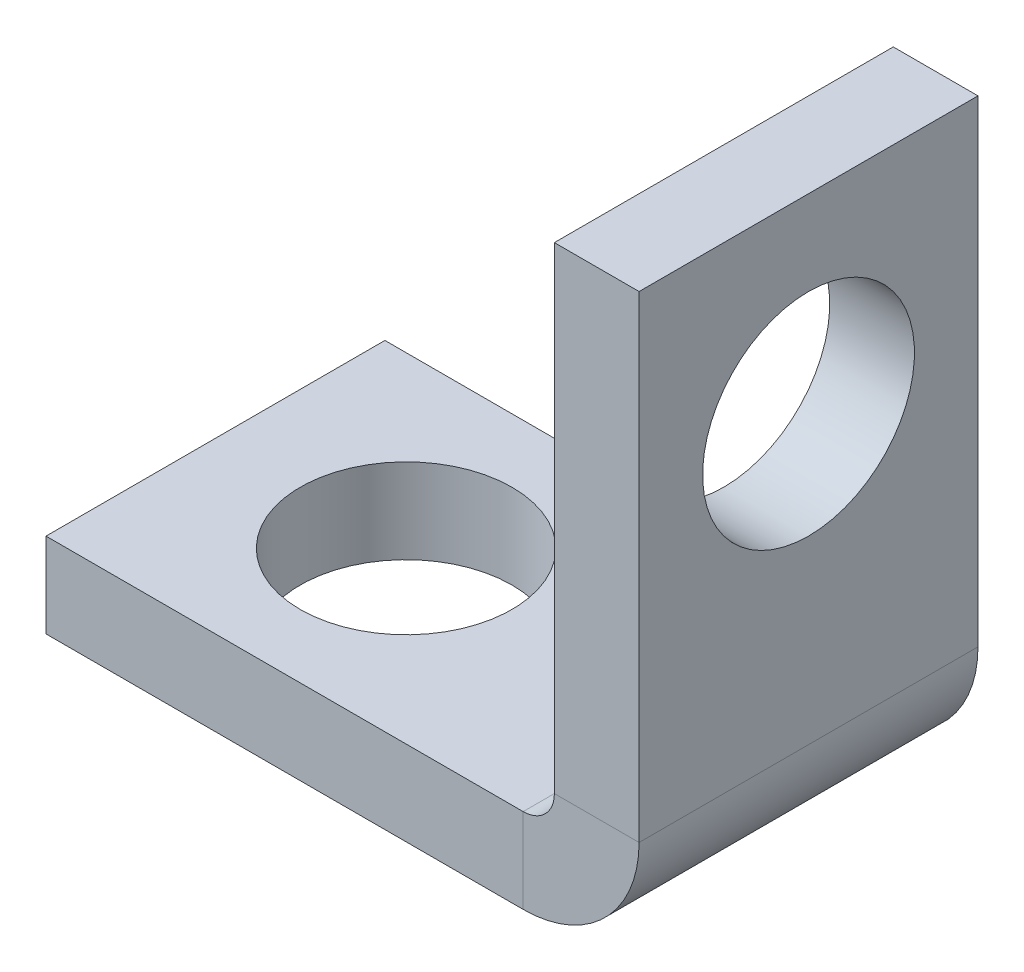
ISO-10303-21;
HEADER;
FILE_DESCRIPTION(('STEP AP214'),'2;1');
FILE_NAME('part.step','',(''),(''),'','','');
FILE_SCHEMA(('AUTOMOTIVE_DESIGN { 1 0 10303 214 1 1 1 1 }'));
ENDSEC;
DATA;
#1=APPLICATION_CONTEXT('core data for automotive mechanical design processes');
#2=APPLICATION_PROTOCOL_DEFINITION('international standard','automotive_design',2000,#1);
#3=PRODUCT_CONTEXT('',#1,'mechanical');
#4=PRODUCT('Part','Part','',(#3));
#5=PRODUCT_RELATED_PRODUCT_CATEGORY('part','',(#4));
#6=PRODUCT_DEFINITION_FORMATION('','',#4);
#7=PRODUCT_DEFINITION_CONTEXT('part definition',#1,'design');
#8=PRODUCT_DEFINITION('design','',#6,#7);
#9=PRODUCT_DEFINITION_SHAPE('','',#8);
#10=(LENGTH_UNIT() NAMED_UNIT(*) SI_UNIT(.MILLI.,.METRE.));
#11=(NAMED_UNIT(*) PLANE_ANGLE_UNIT() SI_UNIT($,.RADIAN.));
#12=(NAMED_UNIT(*) SI_UNIT($,.STERADIAN.) SOLID_ANGLE_UNIT());
#13=UNCERTAINTY_MEASURE_WITH_UNIT(LENGTH_MEASURE(1.E-05),#10,'distance_accuracy_value','');
#14=(GEOMETRIC_REPRESENTATION_CONTEXT(3) GLOBAL_UNCERTAINTY_ASSIGNED_CONTEXT((#13)) GLOBAL_UNIT_ASSIGNED_CONTEXT((#10,
#11,#12)) REPRESENTATION_CONTEXT('',''));
#15=CARTESIAN_POINT('',(0.,0.,0.));
#16=DIRECTION('',(0.,0.,1.));
#17=DIRECTION('',(1.,0.,0.));
#18=AXIS2_PLACEMENT_3D('',#15,#16,#17);
#19=CARTESIAN_POINT('',(7.,-2.,-4.));
#20=DIRECTION('',(0.,0.,-1.));
#21=DIRECTION('',(-1.,0.,0.));
#22=AXIS2_PLACEMENT_3D('',#19,#20,#21);
#23=PLANE('',#22);
#24=DIRECTION('',(-1.,0.,0.));
#25=VECTOR('',#24,1.);
#26=CARTESIAN_POINT('',(7.,0.,-4.));
#27=LINE('',#26,#25);
#28=CARTESIAN_POINT('',(4.2634,0.,-4.));
#29=VERTEX_POINT('',#28);
#30=CARTESIAN_POINT('',(-7.,0.,-4.));
#31=VERTEX_POINT('',#30);
#32=EDGE_CURVE('E94',#29,#31,#27,.T.);
#33=ORIENTED_EDGE('',*,*,#32,.F.);
#34=DIRECTION('',(0.,-1.,0.));
#35=VECTOR('',#34,1.);
#36=CARTESIAN_POINT('',(4.2634,0.,-4.));
#37=LINE('',#36,#35);
#38=CARTESIAN_POINT('',(4.2634,-2.,-4.));
#39=VERTEX_POINT('',#38);
#40=EDGE_CURVE('E121',#29,#39,#37,.T.);
#41=ORIENTED_EDGE('',*,*,#40,.T.);
#42=DIRECTION('',(-1.,0.,0.));
#43=VECTOR('',#42,1.);
#44=CARTESIAN_POINT('',(7.,-2.,-4.));
#45=LINE('',#44,#43);
#46=CARTESIAN_POINT('',(-7.,-2.,-4.));
#47=VERTEX_POINT('',#46);
#48=EDGE_CURVE('E83',#39,#47,#45,.T.);
#49=ORIENTED_EDGE('',*,*,#48,.T.);
#50=DIRECTION('',(0.,1.,0.));
#51=VECTOR('',#50,1.);
#52=CARTESIAN_POINT('',(-7.,-2.,-4.));
#53=LINE('',#52,#51);
#54=EDGE_CURVE('E13',#47,#31,#53,.T.);
#55=ORIENTED_EDGE('',*,*,#54,.T.);
#56=EDGE_LOOP('',(#33,#41,#49,#55));
#57=FACE_BOUND('',#56,.T.);
#58=ADVANCED_FACE('F60',(#57),#23,.T.);
#59=CARTESIAN_POINT('',(0.,-2.,0.));
#60=DIRECTION('',(0.,1.,0.));
#61=DIRECTION('',(0.,0.,1.));
#62=AXIS2_PLACEMENT_3D('',#59,#60,#61);
#63=PLANE('',#62);
#64=CARTESIAN_POINT('',(-2.5,-2.,0.));
#65=DIRECTION('',(0.,1.,0.));
#66=DIRECTION('',(0.,0.,1.));
#67=AXIS2_PLACEMENT_3D('',#64,#65,#66);
#68=CIRCLE('',#67,2.5);
#69=CARTESIAN_POINT('',(-2.5,-2.,2.5));
#70=VERTEX_POINT('',#69);
#71=EDGE_CURVE('E106',#70,#70,#68,.T.);
#72=ORIENTED_EDGE('',*,*,#71,.T.);
#73=EDGE_LOOP('',(#72));
#74=FACE_BOUND('',#73,.T.);
#75=DIRECTION('',(0.,0.,-1.));
#76=VECTOR('',#75,1.);
#77=CARTESIAN_POINT('',(4.2634,-2.,-4.));
#78=LINE('',#77,#76);
#79=CARTESIAN_POINT('',(4.2634,-2.,4.));
#80=VERTEX_POINT('',#79);
#81=EDGE_CURVE('E137',#39,#80,#78,.F.);
#82=ORIENTED_EDGE('',*,*,#81,.T.);
#83=DIRECTION('',(1.,0.,0.));
#84=VECTOR('',#83,1.);
#85=CARTESIAN_POINT('',(7.,-2.,4.));
#86=LINE('',#85,#84);
#87=CARTESIAN_POINT('',(-7.,-2.,4.));
#88=VERTEX_POINT('',#87);
#89=EDGE_CURVE('E114',#88,#80,#86,.T.);
#90=ORIENTED_EDGE('',*,*,#89,.F.);
#91=DIRECTION('',(0.,0.,1.));
#92=VECTOR('',#91,1.);
#93=CARTESIAN_POINT('',(-7.,-2.,4.));
#94=LINE('',#93,#92);
#95=EDGE_CURVE('E99',#47,#88,#94,.T.);
#96=ORIENTED_EDGE('',*,*,#95,.F.);
#97=ORIENTED_EDGE('',*,*,#48,.F.);
#98=EDGE_LOOP('',(#82,#90,#96,#97));
#99=FACE_BOUND('',#98,.T.);
#100=ADVANCED_FACE('F223',(#74,#99),#63,.F.);
#101=CARTESIAN_POINT('',(0.,0.,0.));
#102=DIRECTION('',(0.,1.,0.));
#103=DIRECTION('',(0.,0.,1.));
#104=AXIS2_PLACEMENT_3D('',#101,#102,#103);
#105=PLANE('',#104);
#106=CARTESIAN_POINT('',(-2.5,0.,0.));
#107=DIRECTION('',(0.,1.,0.));
#108=DIRECTION('',(0.,0.,1.));
#109=AXIS2_PLACEMENT_3D('',#106,#107,#108);
#110=CIRCLE('',#109,2.5);
#111=CARTESIAN_POINT('',(-2.5,0.,2.5));
#112=VERTEX_POINT('',#111);
#113=EDGE_CURVE('E110',#112,#112,#110,.T.);
#114=ORIENTED_EDGE('',*,*,#113,.F.);
#115=EDGE_LOOP('',(#114));
#116=FACE_BOUND('',#115,.T.);
#117=DIRECTION('',(1.,0.,0.));
#118=VECTOR('',#117,1.);
#119=CARTESIAN_POINT('',(7.,0.,4.));
#120=LINE('',#119,#118);
#121=CARTESIAN_POINT('',(-7.,0.,4.));
#122=VERTEX_POINT('',#121);
#123=CARTESIAN_POINT('',(4.2634,0.,4.));
#124=VERTEX_POINT('',#123);
#125=EDGE_CURVE('E100',#122,#124,#120,.T.);
#126=ORIENTED_EDGE('',*,*,#125,.T.);
#127=DIRECTION('',(0.,0.,-1.));
#128=VECTOR('',#127,1.);
#129=CARTESIAN_POINT('',(4.2634,0.,-4.));
#130=LINE('',#129,#128);
#131=EDGE_CURVE('E75',#29,#124,#130,.F.);
#132=ORIENTED_EDGE('',*,*,#131,.F.);
#133=ORIENTED_EDGE('',*,*,#32,.T.);
#134=DIRECTION('',(0.,0.,1.));
#135=VECTOR('',#134,1.);
#136=CARTESIAN_POINT('',(-7.,0.,4.));
#137=LINE('',#136,#135);
#138=EDGE_CURVE('E97',#31,#122,#137,.T.);
#139=ORIENTED_EDGE('',*,*,#138,.T.);
#140=EDGE_LOOP('',(#126,#132,#133,#139));
#141=FACE_BOUND('',#140,.T.);
#142=ADVANCED_FACE('F95',(#116,#141),#105,.T.);
#143=CARTESIAN_POINT('',(-7.,-2.,4.));
#144=DIRECTION('',(-1.,0.,0.));
#145=DIRECTION('',(0.,0.,1.));
#146=AXIS2_PLACEMENT_3D('',#143,#144,#145);
#147=PLANE('',#146);
#148=ORIENTED_EDGE('',*,*,#138,.F.);
#149=ORIENTED_EDGE('',*,*,#54,.F.);
#150=ORIENTED_EDGE('',*,*,#95,.T.);
#151=DIRECTION('',(0.,1.,0.));
#152=VECTOR('',#151,1.);
#153=CARTESIAN_POINT('',(-7.,-2.,4.));
#154=LINE('',#153,#152);
#155=EDGE_CURVE('E64',#88,#122,#154,.T.);
#156=ORIENTED_EDGE('',*,*,#155,.T.);
#157=EDGE_LOOP('',(#148,#149,#150,#156));
#158=FACE_BOUND('',#157,.T.);
#159=ADVANCED_FACE('F62',(#158),#147,.T.);
#160=CARTESIAN_POINT('',(7.,-2.,4.));
#161=DIRECTION('',(0.,0.,1.));
#162=DIRECTION('',(1.,0.,0.));
#163=AXIS2_PLACEMENT_3D('',#160,#161,#162);
#164=PLANE('',#163);
#165=DIRECTION('',(0.,-1.,0.));
#166=VECTOR('',#165,1.);
#167=CARTESIAN_POINT('',(4.2634,0.,4.));
#168=LINE('',#167,#166);
#169=EDGE_CURVE('E119',#124,#80,#168,.T.);
#170=ORIENTED_EDGE('',*,*,#169,.F.);
#171=ORIENTED_EDGE('',*,*,#125,.F.);
#172=ORIENTED_EDGE('',*,*,#155,.F.);
#173=ORIENTED_EDGE('',*,*,#89,.T.);
#174=EDGE_LOOP('',(#170,#171,#172,#173));
#175=FACE_BOUND('',#174,.T.);
#176=ADVANCED_FACE('F228',(#175),#164,.T.);
#177=CARTESIAN_POINT('',(-2.5,-2.,0.));
#178=DIRECTION('',(0.,1.,0.));
#179=DIRECTION('',(0.,0.,1.));
#180=AXIS2_PLACEMENT_3D('',#177,#178,#179);
#181=CYLINDRICAL_SURFACE('',#180,2.5);
#182=ORIENTED_EDGE('',*,*,#71,.F.);
#183=EDGE_LOOP('',(#182));
#184=FACE_BOUND('',#183,.T.);
#185=ORIENTED_EDGE('',*,*,#113,.T.);
#186=EDGE_LOOP('',(#185));
#187=FACE_BOUND('',#186,.T.);
#188=ADVANCED_FACE('F262',(#184,#187),#181,.F.);
#189=CARTESIAN_POINT('',(4.2634,0.7366,4.));
#190=DIRECTION('',(0.,0.,1.));
#191=DIRECTION('',(1.,0.,0.));
#192=AXIS2_PLACEMENT_3D('',#189,#190,#191);
#193=PLANE('',#192);
#194=DIRECTION('',(-1.,0.,0.));
#195=VECTOR('',#194,1.);
#196=CARTESIAN_POINT('',(7.,0.73659999999999,4.));
#197=LINE('',#196,#195);
#198=CARTESIAN_POINT('',(5.,0.736599999999997,4.));
#199=VERTEX_POINT('',#198);
#200=CARTESIAN_POINT('',(7.,0.73659999999999,4.));
#201=VERTEX_POINT('',#200);
#202=EDGE_CURVE('E142',#199,#201,#197,.F.);
#203=ORIENTED_EDGE('',*,*,#202,.F.);
#204=CARTESIAN_POINT('',(4.2634,0.7366,4.));
#205=DIRECTION('',(0.,0.,-1.));
#206=DIRECTION('',(-1.,0.,0.));
#207=AXIS2_PLACEMENT_3D('',#204,#205,#206);
#208=CIRCLE('',#207,0.7366);
#209=EDGE_CURVE('E131',#124,#199,#208,.F.);
#210=ORIENTED_EDGE('',*,*,#209,.F.);
#211=ORIENTED_EDGE('',*,*,#169,.T.);
#212=CARTESIAN_POINT('',(4.2634,0.7366,4.));
#213=DIRECTION('',(0.,0.,-1.));
#214=DIRECTION('',(-1.,0.,0.));
#215=AXIS2_PLACEMENT_3D('',#212,#213,#214);
#216=CIRCLE('',#215,2.7366);
#217=EDGE_CURVE('E123',#80,#201,#216,.F.);
#218=ORIENTED_EDGE('',*,*,#217,.T.);
#219=EDGE_LOOP('',(#203,#210,#211,#218));
#220=FACE_BOUND('',#219,.T.);
#221=ADVANCED_FACE('F229',(#220),#193,.T.);
#222=CARTESIAN_POINT('',(4.2634,0.7366,-4.));
#223=DIRECTION('',(0.,0.,1.));
#224=DIRECTION('',(1.,0.,0.));
#225=AXIS2_PLACEMENT_3D('',#222,#223,#224);
#226=PLANE('',#225);
#227=CARTESIAN_POINT('',(4.2634,0.7366,-4.));
#228=DIRECTION('',(0.,0.,-1.));
#229=DIRECTION('',(-1.,0.,0.));
#230=AXIS2_PLACEMENT_3D('',#227,#228,#229);
#231=CIRCLE('',#230,0.7366);
#232=CARTESIAN_POINT('',(5.,0.736599999999997,-4.));
#233=VERTEX_POINT('',#232);
#234=EDGE_CURVE('E126',#233,#29,#231,.T.);
#235=ORIENTED_EDGE('',*,*,#234,.F.);
#236=DIRECTION('',(-1.,0.,0.));
#237=VECTOR('',#236,1.);
#238=CARTESIAN_POINT('',(5.,0.736599999999997,-4.));
#239=LINE('',#238,#237);
#240=CARTESIAN_POINT('',(7.,0.73659999999999,-4.));
#241=VERTEX_POINT('',#240);
#242=EDGE_CURVE('E148',#233,#241,#239,.F.);
#243=ORIENTED_EDGE('',*,*,#242,.T.);
#244=CARTESIAN_POINT('',(4.2634,0.7366,-4.));
#245=DIRECTION('',(0.,0.,-1.));
#246=DIRECTION('',(-1.,0.,0.));
#247=AXIS2_PLACEMENT_3D('',#244,#245,#246);
#248=CIRCLE('',#247,2.7366);
#249=EDGE_CURVE('E134',#241,#39,#248,.T.);
#250=ORIENTED_EDGE('',*,*,#249,.T.);
#251=ORIENTED_EDGE('',*,*,#40,.F.);
#252=EDGE_LOOP('',(#235,#243,#250,#251));
#253=FACE_BOUND('',#252,.T.);
#254=ADVANCED_FACE('F240',(#253),#226,.F.);
#255=CARTESIAN_POINT('',(4.2634,0.7366,-4.));
#256=DIRECTION('',(0.,0.,-1.));
#257=DIRECTION('',(1.,0.,0.));
#258=AXIS2_PLACEMENT_3D('',#255,#256,#257);
#259=CYLINDRICAL_SURFACE('',#258,2.7366);
#260=ORIENTED_EDGE('',*,*,#81,.F.);
#261=ORIENTED_EDGE('',*,*,#249,.F.);
#262=DIRECTION('',(0.,0.,-1.));
#263=VECTOR('',#262,1.);
#264=CARTESIAN_POINT('',(7.,0.73659999999999,4.));
#265=LINE('',#264,#263);
#266=EDGE_CURVE('E151',#241,#201,#265,.F.);
#267=ORIENTED_EDGE('',*,*,#266,.T.);
#268=ORIENTED_EDGE('',*,*,#217,.F.);
#269=EDGE_LOOP('',(#260,#261,#267,#268));
#270=FACE_BOUND('',#269,.T.);
#271=ADVANCED_FACE('F230',(#270),#259,.T.);
#272=CARTESIAN_POINT('',(4.2634,0.7366,-4.));
#273=DIRECTION('',(0.,0.,-1.));
#274=DIRECTION('',(1.,0.,0.));
#275=AXIS2_PLACEMENT_3D('',#272,#273,#274);
#276=CYLINDRICAL_SURFACE('',#275,0.7366);
#277=ORIENTED_EDGE('',*,*,#131,.T.);
#278=ORIENTED_EDGE('',*,*,#209,.T.);
#279=DIRECTION('',(0.,0.,-1.));
#280=VECTOR('',#279,1.);
#281=CARTESIAN_POINT('',(5.,0.736599999999997,4.));
#282=LINE('',#281,#280);
#283=EDGE_CURVE('E145',#199,#233,#282,.T.);
#284=ORIENTED_EDGE('',*,*,#283,.T.);
#285=ORIENTED_EDGE('',*,*,#234,.T.);
#286=EDGE_LOOP('',(#277,#278,#284,#285));
#287=FACE_BOUND('',#286,.T.);
#288=ADVANCED_FACE('F242',(#287),#276,.F.);
#289=CARTESIAN_POINT('',(7.,0.,0.));
#290=DIRECTION('',(-1.,0.,0.));
#291=DIRECTION('',(0.,-1.,0.));
#292=AXIS2_PLACEMENT_3D('',#289,#290,#291);
#293=PLANE('',#292);
#294=CARTESIAN_POINT('',(7.00000000000003,7.5,0.));
#295=DIRECTION('',(-1.,0.,0.));
#296=DIRECTION('',(0.,-1.,0.));
#297=AXIS2_PLACEMENT_3D('',#294,#295,#296);
#298=CIRCLE('',#297,2.5);
#299=CARTESIAN_POINT('',(7.00000000000002,5.,0.));
#300=VERTEX_POINT('',#299);
#301=EDGE_CURVE('E157',#300,#300,#298,.F.);
#302=ORIENTED_EDGE('',*,*,#301,.F.);
#303=EDGE_LOOP('',(#302));
#304=FACE_BOUND('',#303,.T.);
#305=ORIENTED_EDGE('',*,*,#266,.F.);
#306=DIRECTION('',(0.,1.,0.));
#307=VECTOR('',#306,1.);
#308=CARTESIAN_POINT('',(7.,0.,-4.));
#309=LINE('',#308,#307);
#310=CARTESIAN_POINT('',(7.00000000000004,12.,-4.));
#311=VERTEX_POINT('',#310);
#312=EDGE_CURVE('E172',#241,#311,#309,.T.);
#313=ORIENTED_EDGE('',*,*,#312,.T.);
#314=DIRECTION('',(0.,0.,1.));
#315=VECTOR('',#314,1.);
#316=CARTESIAN_POINT('',(7.00000000000004,12.,0.));
#317=LINE('',#316,#315);
#318=CARTESIAN_POINT('',(7.00000000000004,12.,4.));
#319=VERTEX_POINT('',#318);
#320=EDGE_CURVE('E175',#311,#319,#317,.T.);
#321=ORIENTED_EDGE('',*,*,#320,.T.);
#322=DIRECTION('',(0.,-1.,0.));
#323=VECTOR('',#322,1.);
#324=CARTESIAN_POINT('',(7.,0.,4.));
#325=LINE('',#324,#323);
#326=EDGE_CURVE('E169',#319,#201,#325,.T.);
#327=ORIENTED_EDGE('',*,*,#326,.T.);
#328=EDGE_LOOP('',(#305,#313,#321,#327));
#329=FACE_BOUND('',#328,.T.);
#330=ADVANCED_FACE('F233',(#304,#329),#293,.F.);
#331=CARTESIAN_POINT('',(5.,0.,0.));
#332=DIRECTION('',(-1.,0.,0.));
#333=DIRECTION('',(0.,-1.,0.));
#334=AXIS2_PLACEMENT_3D('',#331,#332,#333);
#335=PLANE('',#334);
#336=CARTESIAN_POINT('',(5.00000000000003,7.50000000000001,0.));
#337=DIRECTION('',(-1.,0.,0.));
#338=DIRECTION('',(0.,-1.,0.));
#339=AXIS2_PLACEMENT_3D('',#336,#337,#338);
#340=CIRCLE('',#339,2.5);
#341=CARTESIAN_POINT('',(5.00000000000002,5.00000000000001,0.));
#342=VERTEX_POINT('',#341);
#343=EDGE_CURVE('E154',#342,#342,#340,.F.);
#344=ORIENTED_EDGE('',*,*,#343,.T.);
#345=EDGE_LOOP('',(#344));
#346=FACE_BOUND('',#345,.T.);
#347=DIRECTION('',(0.,-1.,0.));
#348=VECTOR('',#347,1.);
#349=CARTESIAN_POINT('',(5.00000000000004,12.,-4.));
#350=LINE('',#349,#348);
#351=CARTESIAN_POINT('',(5.00000000000004,12.,-4.));
#352=VERTEX_POINT('',#351);
#353=EDGE_CURVE('E163',#233,#352,#350,.F.);
#354=ORIENTED_EDGE('',*,*,#353,.F.);
#355=ORIENTED_EDGE('',*,*,#283,.F.);
#356=DIRECTION('',(0.,1.,0.));
#357=VECTOR('',#356,1.);
#358=CARTESIAN_POINT('',(5.,0.,4.));
#359=LINE('',#358,#357);
#360=CARTESIAN_POINT('',(5.00000000000004,12.,4.));
#361=VERTEX_POINT('',#360);
#362=EDGE_CURVE('E160',#361,#199,#359,.F.);
#363=ORIENTED_EDGE('',*,*,#362,.F.);
#364=DIRECTION('',(0.,0.,-1.));
#365=VECTOR('',#364,1.);
#366=CARTESIAN_POINT('',(5.00000000000004,12.,4.));
#367=LINE('',#366,#365);
#368=EDGE_CURVE('E166',#352,#361,#367,.F.);
#369=ORIENTED_EDGE('',*,*,#368,.F.);
#370=EDGE_LOOP('',(#354,#355,#363,#369));
#371=FACE_BOUND('',#370,.T.);
#372=ADVANCED_FACE('F198',(#346,#371),#335,.T.);
#373=CARTESIAN_POINT('',(7.,0.,4.));
#374=DIRECTION('',(0.,0.,-1.));
#375=DIRECTION('',(-1.,0.,0.));
#376=AXIS2_PLACEMENT_3D('',#373,#374,#375);
#377=PLANE('',#376);
#378=ORIENTED_EDGE('',*,*,#202,.T.);
#379=ORIENTED_EDGE('',*,*,#326,.F.);
#380=DIRECTION('',(-1.,0.,0.));
#381=VECTOR('',#380,1.);
#382=CARTESIAN_POINT('',(7.00000000000004,12.,4.));
#383=LINE('',#382,#381);
#384=EDGE_CURVE('E178',#319,#361,#383,.T.);
#385=ORIENTED_EDGE('',*,*,#384,.T.);
#386=ORIENTED_EDGE('',*,*,#362,.T.);
#387=EDGE_LOOP('',(#378,#379,#385,#386));
#388=FACE_BOUND('',#387,.T.);
#389=ADVANCED_FACE('F204',(#388),#377,.F.);
#390=CARTESIAN_POINT('',(7.00000000000004,12.,-4.));
#391=DIRECTION('',(0.,0.,1.));
#392=DIRECTION('',(1.,0.,0.));
#393=AXIS2_PLACEMENT_3D('',#390,#391,#392);
#394=PLANE('',#393);
#395=ORIENTED_EDGE('',*,*,#242,.F.);
#396=ORIENTED_EDGE('',*,*,#353,.T.);
#397=DIRECTION('',(-1.,0.,0.));
#398=VECTOR('',#397,1.);
#399=CARTESIAN_POINT('',(7.00000000000004,12.,-4.));
#400=LINE('',#399,#398);
#401=EDGE_CURVE('E129',#311,#352,#400,.T.);
#402=ORIENTED_EDGE('',*,*,#401,.F.);
#403=ORIENTED_EDGE('',*,*,#312,.F.);
#404=EDGE_LOOP('',(#395,#396,#402,#403));
#405=FACE_BOUND('',#404,.T.);
#406=ADVANCED_FACE('F237',(#405),#394,.F.);
#407=CARTESIAN_POINT('',(7.00000000000004,12.,4.));
#408=DIRECTION('',(0.,-1.,0.));
#409=DIRECTION('',(1.,0.,0.));
#410=AXIS2_PLACEMENT_3D('',#407,#408,#409);
#411=PLANE('',#410);
#412=ORIENTED_EDGE('',*,*,#368,.T.);
#413=ORIENTED_EDGE('',*,*,#384,.F.);
#414=ORIENTED_EDGE('',*,*,#320,.F.);
#415=ORIENTED_EDGE('',*,*,#401,.T.);
#416=EDGE_LOOP('',(#412,#413,#414,#415));
#417=FACE_BOUND('',#416,.T.);
#418=ADVANCED_FACE('F187',(#417),#411,.F.);
#419=CARTESIAN_POINT('',(7.00000000000003,7.5,0.));
#420=DIRECTION('',(-1.,0.,0.));
#421=DIRECTION('',(0.,-1.,0.));
#422=AXIS2_PLACEMENT_3D('',#419,#420,#421);
#423=CYLINDRICAL_SURFACE('',#422,2.5);
#424=ORIENTED_EDGE('',*,*,#301,.T.);
#425=EDGE_LOOP('',(#424));
#426=FACE_BOUND('',#425,.T.);
#427=ORIENTED_EDGE('',*,*,#343,.F.);
#428=EDGE_LOOP('',(#427));
#429=FACE_BOUND('',#428,.T.);
#430=ADVANCED_FACE('F378',(#426,#429),#423,.F.);
#431=CLOSED_SHELL('',(#58,#100,#142,#159,#176,#188,#221,#254,#271,#288,#330,#372,#389,#406,#418,#430));
#432=MANIFOLD_SOLID_BREP('B2',#431);
#433=ADVANCED_BREP_SHAPE_REPRESENTATION('',(#18,#432),#14);
#434=SHAPE_DEFINITION_REPRESENTATION(#9,#433);
ENDSEC;
END-ISO-10303-21;
